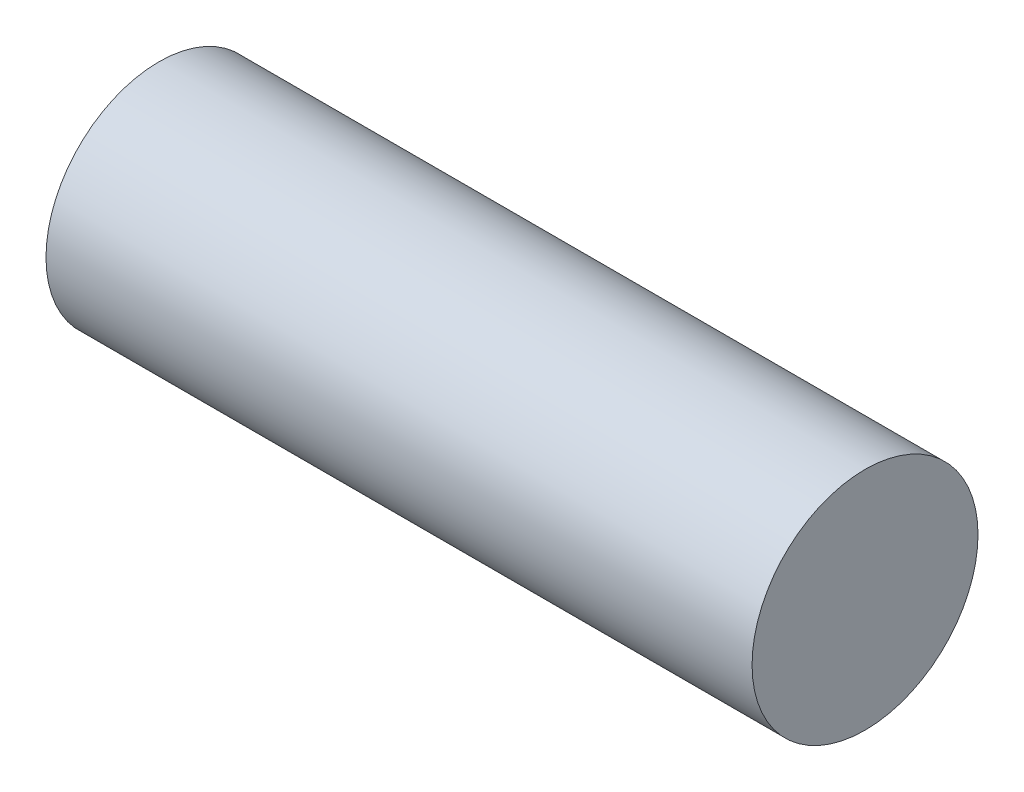
ISO-10303-21;
HEADER;
FILE_DESCRIPTION(('STEP AP214'),'2;1');
FILE_NAME('part.step','',(''),(''),'','','');
FILE_SCHEMA(('AUTOMOTIVE_DESIGN { 1 0 10303 214 1 1 1 1 }'));
ENDSEC;
DATA;
#1=APPLICATION_CONTEXT('core data for automotive mechanical design processes');
#2=APPLICATION_PROTOCOL_DEFINITION('international standard','automotive_design',2000,#1);
#3=PRODUCT_CONTEXT('',#1,'mechanical');
#4=PRODUCT('Part','Part','',(#3));
#5=PRODUCT_RELATED_PRODUCT_CATEGORY('part','',(#4));
#6=PRODUCT_DEFINITION_FORMATION('','',#4);
#7=PRODUCT_DEFINITION_CONTEXT('part definition',#1,'design');
#8=PRODUCT_DEFINITION('design','',#6,#7);
#9=PRODUCT_DEFINITION_SHAPE('','',#8);
#10=(LENGTH_UNIT() NAMED_UNIT(*) SI_UNIT(.MILLI.,.METRE.));
#11=(NAMED_UNIT(*) PLANE_ANGLE_UNIT() SI_UNIT($,.RADIAN.));
#12=(NAMED_UNIT(*) SI_UNIT($,.STERADIAN.) SOLID_ANGLE_UNIT());
#13=UNCERTAINTY_MEASURE_WITH_UNIT(LENGTH_MEASURE(1.E-05),#10,'distance_accuracy_value','');
#14=(GEOMETRIC_REPRESENTATION_CONTEXT(3) GLOBAL_UNCERTAINTY_ASSIGNED_CONTEXT((#13)) GLOBAL_UNIT_ASSIGNED_CONTEXT((#10,
#11,#12)) REPRESENTATION_CONTEXT('',''));
#15=CARTESIAN_POINT('',(0.,0.,0.));
#16=DIRECTION('',(0.,0.,1.));
#17=DIRECTION('',(1.,0.,0.));
#18=AXIS2_PLACEMENT_3D('',#15,#16,#17);
#19=CARTESIAN_POINT('',(25.,0.,0.));
#20=DIRECTION('',(-1.,0.,0.));
#21=DIRECTION('',(0.,0.,1.));
#22=AXIS2_PLACEMENT_3D('',#19,#20,#21);
#23=CYLINDRICAL_SURFACE('',#22,4.);
#24=CARTESIAN_POINT('',(25.,0.,0.));
#25=DIRECTION('',(1.,0.,0.));
#26=DIRECTION('',(0.,0.,-1.));
#27=AXIS2_PLACEMENT_3D('',#24,#25,#26);
#28=CIRCLE('',#27,4.);
#29=CARTESIAN_POINT('',(25.,0.,-4.));
#30=VERTEX_POINT('',#29);
#31=EDGE_CURVE('E10',#30,#30,#28,.T.);
#32=ORIENTED_EDGE('',*,*,#31,.F.);
#33=EDGE_LOOP('',(#32));
#34=FACE_BOUND('',#33,.T.);
#35=CARTESIAN_POINT('',(0.,0.,0.));
#36=DIRECTION('',(1.,0.,0.));
#37=DIRECTION('',(0.,0.,-1.));
#38=AXIS2_PLACEMENT_3D('',#35,#36,#37);
#39=CIRCLE('',#38,4.);
#40=CARTESIAN_POINT('',(0.,0.,-4.));
#41=VERTEX_POINT('',#40);
#42=EDGE_CURVE('E40',#41,#41,#39,.T.);
#43=ORIENTED_EDGE('',*,*,#42,.T.);
#44=EDGE_LOOP('',(#43));
#45=FACE_BOUND('',#44,.T.);
#46=ADVANCED_FACE('F37',(#34,#45),#23,.T.);
#47=CARTESIAN_POINT('',(25.,0.,0.));
#48=DIRECTION('',(1.,0.,0.));
#49=DIRECTION('',(0.,0.,-1.));
#50=AXIS2_PLACEMENT_3D('',#47,#48,#49);
#51=PLANE('',#50);
#52=ORIENTED_EDGE('',*,*,#31,.T.);
#53=EDGE_LOOP('',(#52));
#54=FACE_BOUND('',#53,.T.);
#55=ADVANCED_FACE('F52',(#54),#51,.T.);
#56=CARTESIAN_POINT('',(0.,0.,0.));
#57=DIRECTION('',(1.,0.,0.));
#58=DIRECTION('',(0.,0.,-1.));
#59=AXIS2_PLACEMENT_3D('',#56,#57,#58);
#60=PLANE('',#59);
#61=ORIENTED_EDGE('',*,*,#42,.F.);
#62=EDGE_LOOP('',(#61));
#63=FACE_BOUND('',#62,.T.);
#64=ADVANCED_FACE('F50',(#63),#60,.F.);
#65=CLOSED_SHELL('',(#46,#55,#64));
#66=MANIFOLD_SOLID_BREP('B2',#65);
#67=ADVANCED_BREP_SHAPE_REPRESENTATION('',(#18,#66),#14);
#68=SHAPE_DEFINITION_REPRESENTATION(#9,#67);
ENDSEC;
END-ISO-10303-21;
